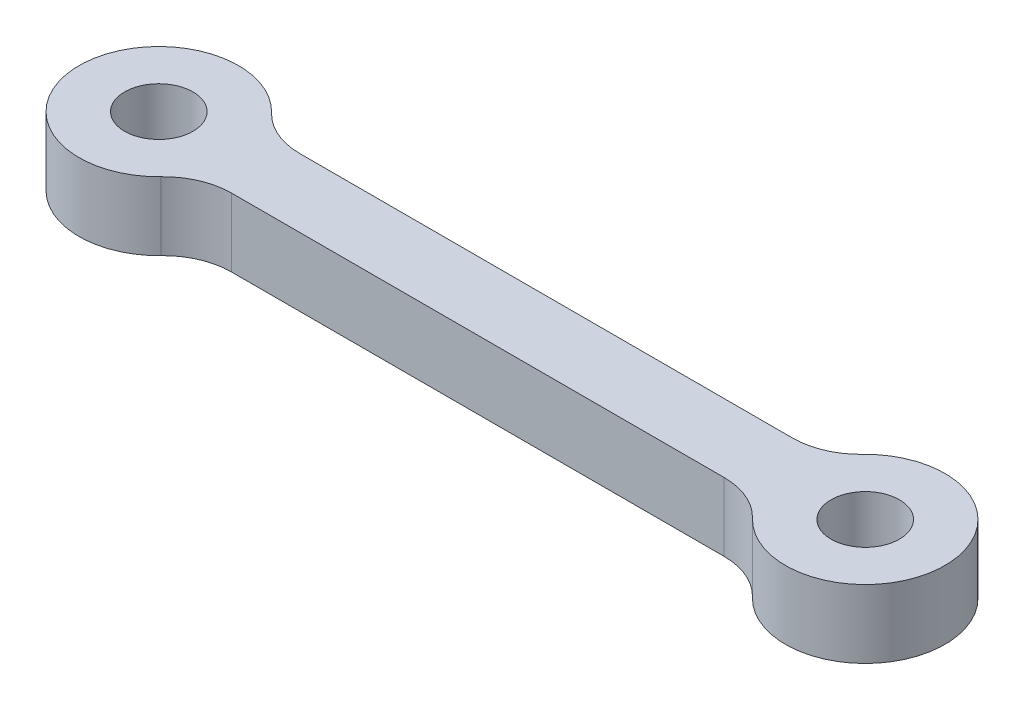
ISO-10303-21;
HEADER;
FILE_DESCRIPTION(('STEP AP214'),'2;1');
FILE_NAME('part.step','',(''),(''),'','','');
FILE_SCHEMA(('AUTOMOTIVE_DESIGN { 1 0 10303 214 1 1 1 1 }'));
ENDSEC;
DATA;
#1=APPLICATION_CONTEXT('core data for automotive mechanical design processes');
#2=APPLICATION_PROTOCOL_DEFINITION('international standard','automotive_design',2000,#1);
#3=PRODUCT_CONTEXT('',#1,'mechanical');
#4=PRODUCT('Part','Part','',(#3));
#5=PRODUCT_RELATED_PRODUCT_CATEGORY('part','',(#4));
#6=PRODUCT_DEFINITION_FORMATION('','',#4);
#7=PRODUCT_DEFINITION_CONTEXT('part definition',#1,'design');
#8=PRODUCT_DEFINITION('design','',#6,#7);
#9=PRODUCT_DEFINITION_SHAPE('','',#8);
#10=(LENGTH_UNIT() NAMED_UNIT(*) SI_UNIT(.MILLI.,.METRE.));
#11=(NAMED_UNIT(*) PLANE_ANGLE_UNIT() SI_UNIT($,.RADIAN.));
#12=(NAMED_UNIT(*) SI_UNIT($,.STERADIAN.) SOLID_ANGLE_UNIT());
#13=UNCERTAINTY_MEASURE_WITH_UNIT(LENGTH_MEASURE(1.E-05),#10,'distance_accuracy_value','');
#14=(GEOMETRIC_REPRESENTATION_CONTEXT(3) GLOBAL_UNCERTAINTY_ASSIGNED_CONTEXT((#13)) GLOBAL_UNIT_ASSIGNED_CONTEXT((#10,
#11,#12)) REPRESENTATION_CONTEXT('',''));
#15=CARTESIAN_POINT('',(0.,0.,0.));
#16=DIRECTION('',(0.,0.,1.));
#17=DIRECTION('',(1.,0.,0.));
#18=AXIS2_PLACEMENT_3D('',#15,#16,#17);
#19=CARTESIAN_POINT('',(15.5,3.,0.));
#20=DIRECTION('',(0.,1.,0.));
#21=DIRECTION('',(0.,0.,1.));
#22=AXIS2_PLACEMENT_3D('',#19,#20,#21);
#23=PLANE('',#22);
#24=CARTESIAN_POINT('',(15.5,3.,0.));
#25=DIRECTION('',(0.,1.,0.));
#26=DIRECTION('',(0.,0.,1.));
#27=AXIS2_PLACEMENT_3D('',#24,#25,#26);
#28=CIRCLE('',#27,1.5);
#29=CARTESIAN_POINT('',(15.5,3.,1.5));
#30=VERTEX_POINT('',#29);
#31=EDGE_CURVE('E182',#30,#30,#28,.T.);
#32=ORIENTED_EDGE('',*,*,#31,.F.);
#33=EDGE_LOOP('',(#32));
#34=FACE_BOUND('',#33,.T.);
#35=DIRECTION('',(1.,0.,0.));
#36=VECTOR('',#35,1.);
#37=CARTESIAN_POINT('',(-12.3377223398316,3.,1.5));
#38=LINE('',#37,#36);
#39=CARTESIAN_POINT('',(-10.8095842401766,3.,1.5));
#40=VERTEX_POINT('',#39);
#41=CARTESIAN_POINT('',(10.8095842401766,3.,1.5));
#42=VERTEX_POINT('',#41);
#43=EDGE_CURVE('E139',#40,#42,#38,.T.);
#44=ORIENTED_EDGE('',*,*,#43,.T.);
#45=CARTESIAN_POINT('',(10.8095842401766,3.,4.5));
#46=DIRECTION('',(0.,1.,0.));
#47=DIRECTION('',(0.,0.,1.));
#48=AXIS2_PLACEMENT_3D('',#45,#46,#47);
#49=CIRCLE('',#48,3.);
#50=CARTESIAN_POINT('',(12.9743915139412,3.,2.42307692307692));
#51=VERTEX_POINT('',#50);
#52=EDGE_CURVE('E160',#42,#51,#49,.F.);
#53=ORIENTED_EDGE('',*,*,#52,.T.);
#54=CARTESIAN_POINT('',(15.5,3.,0.));
#55=DIRECTION('',(0.,1.,0.));
#56=DIRECTION('',(0.,0.,1.));
#57=AXIS2_PLACEMENT_3D('',#54,#55,#56);
#58=CIRCLE('',#57,3.5);
#59=CARTESIAN_POINT('',(12.9743915139412,3.,-2.42307692307693));
#60=VERTEX_POINT('',#59);
#61=EDGE_CURVE('E133',#51,#60,#58,.T.);
#62=ORIENTED_EDGE('',*,*,#61,.T.);
#63=CARTESIAN_POINT('',(10.8095842401766,3.,-4.50000000000001));
#64=DIRECTION('',(0.,1.,0.));
#65=DIRECTION('',(0.,0.,1.));
#66=AXIS2_PLACEMENT_3D('',#63,#64,#65);
#67=CIRCLE('',#66,3.);
#68=CARTESIAN_POINT('',(10.8095842401766,3.,-1.50000000000001));
#69=VERTEX_POINT('',#68);
#70=EDGE_CURVE('E156',#60,#69,#67,.F.);
#71=ORIENTED_EDGE('',*,*,#70,.T.);
#72=DIRECTION('',(-1.,0.,0.));
#73=VECTOR('',#72,1.);
#74=CARTESIAN_POINT('',(-12.3377223398316,3.,-1.5));
#75=LINE('',#74,#73);
#76=CARTESIAN_POINT('',(-10.8095842401766,3.,-1.5));
#77=VERTEX_POINT('',#76);
#78=EDGE_CURVE('E172',#69,#77,#75,.T.);
#79=ORIENTED_EDGE('',*,*,#78,.T.);
#80=CARTESIAN_POINT('',(-10.8095842401766,3.,-4.5));
#81=DIRECTION('',(0.,1.,0.));
#82=DIRECTION('',(0.,0.,1.));
#83=AXIS2_PLACEMENT_3D('',#80,#81,#82);
#84=CIRCLE('',#83,3.);
#85=CARTESIAN_POINT('',(-12.9743915139412,3.,-2.42307692307692));
#86=VERTEX_POINT('',#85);
#87=EDGE_CURVE('E114',#77,#86,#84,.F.);
#88=ORIENTED_EDGE('',*,*,#87,.T.);
#89=CARTESIAN_POINT('',(-15.5,3.,0.));
#90=DIRECTION('',(0.,1.,0.));
#91=DIRECTION('',(0.,0.,1.));
#92=AXIS2_PLACEMENT_3D('',#89,#90,#91);
#93=CIRCLE('',#92,3.5);
#94=CARTESIAN_POINT('',(-12.9743915139412,3.,2.42307692307692));
#95=VERTEX_POINT('',#94);
#96=EDGE_CURVE('E122',#86,#95,#93,.T.);
#97=ORIENTED_EDGE('',*,*,#96,.T.);
#98=CARTESIAN_POINT('',(-10.8095842401766,3.,4.5));
#99=DIRECTION('',(0.,1.,0.));
#100=DIRECTION('',(0.,0.,1.));
#101=AXIS2_PLACEMENT_3D('',#98,#99,#100);
#102=CIRCLE('',#101,3.);
#103=EDGE_CURVE('E11',#95,#40,#102,.F.);
#104=ORIENTED_EDGE('',*,*,#103,.T.);
#105=EDGE_LOOP('',(#44,#53,#62,#71,#79,#88,#97,#104));
#106=FACE_BOUND('',#105,.T.);
#107=CARTESIAN_POINT('',(-15.5,3.,0.));
#108=DIRECTION('',(0.,1.,0.));
#109=DIRECTION('',(0.,0.,1.));
#110=AXIS2_PLACEMENT_3D('',#107,#108,#109);
#111=CIRCLE('',#110,1.5);
#112=CARTESIAN_POINT('',(-15.5,3.,1.5));
#113=VERTEX_POINT('',#112);
#114=EDGE_CURVE('E189',#113,#113,#111,.T.);
#115=ORIENTED_EDGE('',*,*,#114,.F.);
#116=EDGE_LOOP('',(#115));
#117=FACE_BOUND('',#116,.T.);
#118=ADVANCED_FACE('F39',(#34,#106,#117),#23,.T.);
#119=CARTESIAN_POINT('',(15.5,0.,0.));
#120=DIRECTION('',(0.,1.,0.));
#121=DIRECTION('',(0.,0.,1.));
#122=AXIS2_PLACEMENT_3D('',#119,#120,#121);
#123=PLANE('',#122);
#124=CARTESIAN_POINT('',(15.5,0.,0.));
#125=DIRECTION('',(0.,1.,0.));
#126=DIRECTION('',(0.,0.,1.));
#127=AXIS2_PLACEMENT_3D('',#124,#125,#126);
#128=CIRCLE('',#127,3.5);
#129=CARTESIAN_POINT('',(12.9743915139412,0.,2.42307692307692));
#130=VERTEX_POINT('',#129);
#131=CARTESIAN_POINT('',(12.9743915139412,0.,-2.42307692307693));
#132=VERTEX_POINT('',#131);
#133=EDGE_CURVE('E135',#130,#132,#128,.T.);
#134=ORIENTED_EDGE('',*,*,#133,.F.);
#135=CARTESIAN_POINT('',(10.8095842401766,0.,4.5));
#136=DIRECTION('',(0.,1.,0.));
#137=DIRECTION('',(0.,0.,1.));
#138=AXIS2_PLACEMENT_3D('',#135,#136,#137);
#139=CIRCLE('',#138,3.);
#140=CARTESIAN_POINT('',(10.8095842401766,0.,1.5));
#141=VERTEX_POINT('',#140);
#142=EDGE_CURVE('E158',#130,#141,#139,.T.);
#143=ORIENTED_EDGE('',*,*,#142,.T.);
#144=DIRECTION('',(1.,0.,0.));
#145=VECTOR('',#144,1.);
#146=CARTESIAN_POINT('',(-12.3377223398316,0.,1.5));
#147=LINE('',#146,#145);
#148=CARTESIAN_POINT('',(-10.8095842401766,0.,1.5));
#149=VERTEX_POINT('',#148);
#150=EDGE_CURVE('E130',#149,#141,#147,.T.);
#151=ORIENTED_EDGE('',*,*,#150,.F.);
#152=CARTESIAN_POINT('',(-10.8095842401766,0.,4.5));
#153=DIRECTION('',(0.,1.,0.));
#154=DIRECTION('',(0.,0.,1.));
#155=AXIS2_PLACEMENT_3D('',#152,#153,#154);
#156=CIRCLE('',#155,3.);
#157=CARTESIAN_POINT('',(-12.9743915139412,0.,2.42307692307692));
#158=VERTEX_POINT('',#157);
#159=EDGE_CURVE('E47',#149,#158,#156,.T.);
#160=ORIENTED_EDGE('',*,*,#159,.T.);
#161=CARTESIAN_POINT('',(-15.5,0.,0.));
#162=DIRECTION('',(0.,1.,0.));
#163=DIRECTION('',(0.,0.,1.));
#164=AXIS2_PLACEMENT_3D('',#161,#162,#163);
#165=CIRCLE('',#164,3.5);
#166=CARTESIAN_POINT('',(-12.9743915139412,0.,-2.42307692307692));
#167=VERTEX_POINT('',#166);
#168=EDGE_CURVE('E120',#167,#158,#165,.T.);
#169=ORIENTED_EDGE('',*,*,#168,.F.);
#170=CARTESIAN_POINT('',(-10.8095842401766,0.,-4.5));
#171=DIRECTION('',(0.,1.,0.));
#172=DIRECTION('',(0.,0.,1.));
#173=AXIS2_PLACEMENT_3D('',#170,#171,#172);
#174=CIRCLE('',#173,3.);
#175=CARTESIAN_POINT('',(-10.8095842401766,0.,-1.5));
#176=VERTEX_POINT('',#175);
#177=EDGE_CURVE('E104',#167,#176,#174,.T.);
#178=ORIENTED_EDGE('',*,*,#177,.T.);
#179=DIRECTION('',(-1.,0.,0.));
#180=VECTOR('',#179,1.);
#181=CARTESIAN_POINT('',(-12.3377223398316,0.,-1.5));
#182=LINE('',#181,#180);
#183=CARTESIAN_POINT('',(10.8095842401766,0.,-1.50000000000001));
#184=VERTEX_POINT('',#183);
#185=EDGE_CURVE('E131',#184,#176,#182,.T.);
#186=ORIENTED_EDGE('',*,*,#185,.F.);
#187=CARTESIAN_POINT('',(10.8095842401766,0.,-4.50000000000001));
#188=DIRECTION('',(0.,1.,0.));
#189=DIRECTION('',(0.,0.,1.));
#190=AXIS2_PLACEMENT_3D('',#187,#188,#189);
#191=CIRCLE('',#190,3.);
#192=EDGE_CURVE('E154',#184,#132,#191,.T.);
#193=ORIENTED_EDGE('',*,*,#192,.T.);
#194=EDGE_LOOP('',(#134,#143,#151,#160,#169,#178,#186,#193));
#195=FACE_BOUND('',#194,.T.);
#196=CARTESIAN_POINT('',(15.5,0.,0.));
#197=DIRECTION('',(0.,1.,0.));
#198=DIRECTION('',(0.,0.,1.));
#199=AXIS2_PLACEMENT_3D('',#196,#197,#198);
#200=CIRCLE('',#199,1.5);
#201=CARTESIAN_POINT('',(15.5,0.,1.5));
#202=VERTEX_POINT('',#201);
#203=EDGE_CURVE('E184',#202,#202,#200,.T.);
#204=ORIENTED_EDGE('',*,*,#203,.T.);
#205=EDGE_LOOP('',(#204));
#206=FACE_BOUND('',#205,.T.);
#207=CARTESIAN_POINT('',(-15.5,0.,0.));
#208=DIRECTION('',(0.,1.,0.));
#209=DIRECTION('',(0.,0.,1.));
#210=AXIS2_PLACEMENT_3D('',#207,#208,#209);
#211=CIRCLE('',#210,1.5);
#212=CARTESIAN_POINT('',(-15.5,0.,1.5));
#213=VERTEX_POINT('',#212);
#214=EDGE_CURVE('E192',#213,#213,#211,.T.);
#215=ORIENTED_EDGE('',*,*,#214,.T.);
#216=EDGE_LOOP('',(#215));
#217=FACE_BOUND('',#216,.T.);
#218=ADVANCED_FACE('F127',(#195,#206,#217),#123,.F.);
#219=CARTESIAN_POINT('',(15.5,3.,0.));
#220=DIRECTION('',(0.,-1.,0.));
#221=DIRECTION('',(0.,0.,-1.));
#222=AXIS2_PLACEMENT_3D('',#219,#220,#221);
#223=CYLINDRICAL_SURFACE('',#222,3.5);
#224=ORIENTED_EDGE('',*,*,#133,.T.);
#225=DIRECTION('',(0.,-1.,0.));
#226=VECTOR('',#225,1.);
#227=CARTESIAN_POINT('',(12.9743915139412,3.,-2.42307692307693));
#228=LINE('',#227,#226);
#229=EDGE_CURVE('E147',#132,#60,#228,.F.);
#230=ORIENTED_EDGE('',*,*,#229,.T.);
#231=ORIENTED_EDGE('',*,*,#61,.F.);
#232=DIRECTION('',(0.,-1.,0.));
#233=VECTOR('',#232,1.);
#234=CARTESIAN_POINT('',(12.9743915139412,3.,2.42307692307692));
#235=LINE('',#234,#233);
#236=EDGE_CURVE('E144',#51,#130,#235,.T.);
#237=ORIENTED_EDGE('',*,*,#236,.T.);
#238=EDGE_LOOP('',(#224,#230,#231,#237));
#239=FACE_BOUND('',#238,.T.);
#240=ADVANCED_FACE('F170',(#239),#223,.T.);
#241=CARTESIAN_POINT('',(-12.3377223398316,3.,-1.5));
#242=DIRECTION('',(0.,0.,1.));
#243=DIRECTION('',(1.,0.,0.));
#244=AXIS2_PLACEMENT_3D('',#241,#242,#243);
#245=PLANE('',#244);
#246=ORIENTED_EDGE('',*,*,#185,.T.);
#247=DIRECTION('',(0.,1.,0.));
#248=VECTOR('',#247,1.);
#249=CARTESIAN_POINT('',(-10.8095842401766,3.,-1.5));
#250=LINE('',#249,#248);
#251=EDGE_CURVE('E109',#176,#77,#250,.T.);
#252=ORIENTED_EDGE('',*,*,#251,.T.);
#253=ORIENTED_EDGE('',*,*,#78,.F.);
#254=DIRECTION('',(0.,1.,0.));
#255=VECTOR('',#254,1.);
#256=CARTESIAN_POINT('',(10.8095842401766,0.,-1.50000000000001));
#257=LINE('',#256,#255);
#258=EDGE_CURVE('E123',#69,#184,#257,.F.);
#259=ORIENTED_EDGE('',*,*,#258,.T.);
#260=EDGE_LOOP('',(#246,#252,#253,#259));
#261=FACE_BOUND('',#260,.T.);
#262=ADVANCED_FACE('F215',(#261),#245,.F.);
#263=CARTESIAN_POINT('',(-15.5,3.,0.));
#264=DIRECTION('',(0.,-1.,0.));
#265=DIRECTION('',(0.,0.,-1.));
#266=AXIS2_PLACEMENT_3D('',#263,#264,#265);
#267=CYLINDRICAL_SURFACE('',#266,3.5);
#268=ORIENTED_EDGE('',*,*,#96,.F.);
#269=DIRECTION('',(0.,-1.,0.));
#270=VECTOR('',#269,1.);
#271=CARTESIAN_POINT('',(-12.9743915139412,3.,-2.42307692307692));
#272=LINE('',#271,#270);
#273=EDGE_CURVE('E108',#86,#167,#272,.T.);
#274=ORIENTED_EDGE('',*,*,#273,.T.);
#275=ORIENTED_EDGE('',*,*,#168,.T.);
#276=DIRECTION('',(0.,-1.,0.));
#277=VECTOR('',#276,1.);
#278=CARTESIAN_POINT('',(-12.9743915139412,3.,2.42307692307692));
#279=LINE('',#278,#277);
#280=EDGE_CURVE('E124',#158,#95,#279,.F.);
#281=ORIENTED_EDGE('',*,*,#280,.T.);
#282=EDGE_LOOP('',(#268,#274,#275,#281));
#283=FACE_BOUND('',#282,.T.);
#284=ADVANCED_FACE('F119',(#283),#267,.T.);
#285=CARTESIAN_POINT('',(-12.3377223398316,3.,1.5));
#286=DIRECTION('',(0.,0.,-1.));
#287=DIRECTION('',(-1.,0.,0.));
#288=AXIS2_PLACEMENT_3D('',#285,#286,#287);
#289=PLANE('',#288);
#290=ORIENTED_EDGE('',*,*,#150,.T.);
#291=DIRECTION('',(0.,1.,0.));
#292=VECTOR('',#291,1.);
#293=CARTESIAN_POINT('',(10.8095842401766,3.,1.5));
#294=LINE('',#293,#292);
#295=EDGE_CURVE('E54',#141,#42,#294,.T.);
#296=ORIENTED_EDGE('',*,*,#295,.T.);
#297=ORIENTED_EDGE('',*,*,#43,.F.);
#298=DIRECTION('',(0.,1.,0.));
#299=VECTOR('',#298,1.);
#300=CARTESIAN_POINT('',(-10.8095842401766,0.,1.5));
#301=LINE('',#300,#299);
#302=EDGE_CURVE('E149',#40,#149,#301,.F.);
#303=ORIENTED_EDGE('',*,*,#302,.T.);
#304=EDGE_LOOP('',(#290,#296,#297,#303));
#305=FACE_BOUND('',#304,.T.);
#306=ADVANCED_FACE('F175',(#305),#289,.F.);
#307=CARTESIAN_POINT('',(15.5,3.,0.));
#308=DIRECTION('',(0.,-1.,0.));
#309=DIRECTION('',(0.,0.,-1.));
#310=AXIS2_PLACEMENT_3D('',#307,#308,#309);
#311=CYLINDRICAL_SURFACE('',#310,1.5);
#312=ORIENTED_EDGE('',*,*,#31,.T.);
#313=EDGE_LOOP('',(#312));
#314=FACE_BOUND('',#313,.T.);
#315=ORIENTED_EDGE('',*,*,#203,.F.);
#316=EDGE_LOOP('',(#315));
#317=FACE_BOUND('',#316,.T.);
#318=ADVANCED_FACE('F208',(#314,#317),#311,.F.);
#319=CARTESIAN_POINT('',(-15.5,3.,0.));
#320=DIRECTION('',(0.,-1.,0.));
#321=DIRECTION('',(0.,0.,-1.));
#322=AXIS2_PLACEMENT_3D('',#319,#320,#321);
#323=CYLINDRICAL_SURFACE('',#322,1.5);
#324=ORIENTED_EDGE('',*,*,#114,.T.);
#325=EDGE_LOOP('',(#324));
#326=FACE_BOUND('',#325,.T.);
#327=ORIENTED_EDGE('',*,*,#214,.F.);
#328=EDGE_LOOP('',(#327));
#329=FACE_BOUND('',#328,.T.);
#330=ADVANCED_FACE('F198',(#326,#329),#323,.F.);
#331=CARTESIAN_POINT('',(-10.8095842401766,3.,-4.5));
#332=DIRECTION('',(0.,-1.,0.));
#333=DIRECTION('',(0.,0.,-1.));
#334=AXIS2_PLACEMENT_3D('',#331,#332,#333);
#335=CYLINDRICAL_SURFACE('',#334,3.);
#336=ORIENTED_EDGE('',*,*,#87,.F.);
#337=ORIENTED_EDGE('',*,*,#251,.F.);
#338=ORIENTED_EDGE('',*,*,#177,.F.);
#339=ORIENTED_EDGE('',*,*,#273,.F.);
#340=EDGE_LOOP('',(#336,#337,#338,#339));
#341=FACE_BOUND('',#340,.T.);
#342=ADVANCED_FACE('F107',(#341),#335,.F.);
#343=CARTESIAN_POINT('',(10.8095842401766,3.,-4.50000000000001));
#344=DIRECTION('',(0.,-1.,0.));
#345=DIRECTION('',(0.,0.,-1.));
#346=AXIS2_PLACEMENT_3D('',#343,#344,#345);
#347=CYLINDRICAL_SURFACE('',#346,3.);
#348=ORIENTED_EDGE('',*,*,#70,.F.);
#349=ORIENTED_EDGE('',*,*,#229,.F.);
#350=ORIENTED_EDGE('',*,*,#192,.F.);
#351=ORIENTED_EDGE('',*,*,#258,.F.);
#352=EDGE_LOOP('',(#348,#349,#350,#351));
#353=FACE_BOUND('',#352,.T.);
#354=ADVANCED_FACE('F223',(#353),#347,.F.);
#355=CARTESIAN_POINT('',(10.8095842401766,3.,4.5));
#356=DIRECTION('',(0.,-1.,0.));
#357=DIRECTION('',(0.,0.,-1.));
#358=AXIS2_PLACEMENT_3D('',#355,#356,#357);
#359=CYLINDRICAL_SURFACE('',#358,3.);
#360=ORIENTED_EDGE('',*,*,#52,.F.);
#361=ORIENTED_EDGE('',*,*,#295,.F.);
#362=ORIENTED_EDGE('',*,*,#142,.F.);
#363=ORIENTED_EDGE('',*,*,#236,.F.);
#364=EDGE_LOOP('',(#360,#361,#362,#363));
#365=FACE_BOUND('',#364,.T.);
#366=ADVANCED_FACE('F174',(#365),#359,.F.);
#367=CARTESIAN_POINT('',(-10.8095842401766,3.,4.5));
#368=DIRECTION('',(0.,-1.,0.));
#369=DIRECTION('',(0.,0.,-1.));
#370=AXIS2_PLACEMENT_3D('',#367,#368,#369);
#371=CYLINDRICAL_SURFACE('',#370,3.);
#372=ORIENTED_EDGE('',*,*,#103,.F.);
#373=ORIENTED_EDGE('',*,*,#280,.F.);
#374=ORIENTED_EDGE('',*,*,#159,.F.);
#375=ORIENTED_EDGE('',*,*,#302,.F.);
#376=EDGE_LOOP('',(#372,#373,#374,#375));
#377=FACE_BOUND('',#376,.T.);
#378=ADVANCED_FACE('F41',(#377),#371,.F.);
#379=CLOSED_SHELL('',(#118,#218,#240,#262,#284,#306,#318,#330,#342,#354,#366,#378));
#380=MANIFOLD_SOLID_BREP('B2',#379);
#381=ADVANCED_BREP_SHAPE_REPRESENTATION('',(#18,#380),#14);
#382=SHAPE_DEFINITION_REPRESENTATION(#9,#381);
ENDSEC;
END-ISO-10303-21;
